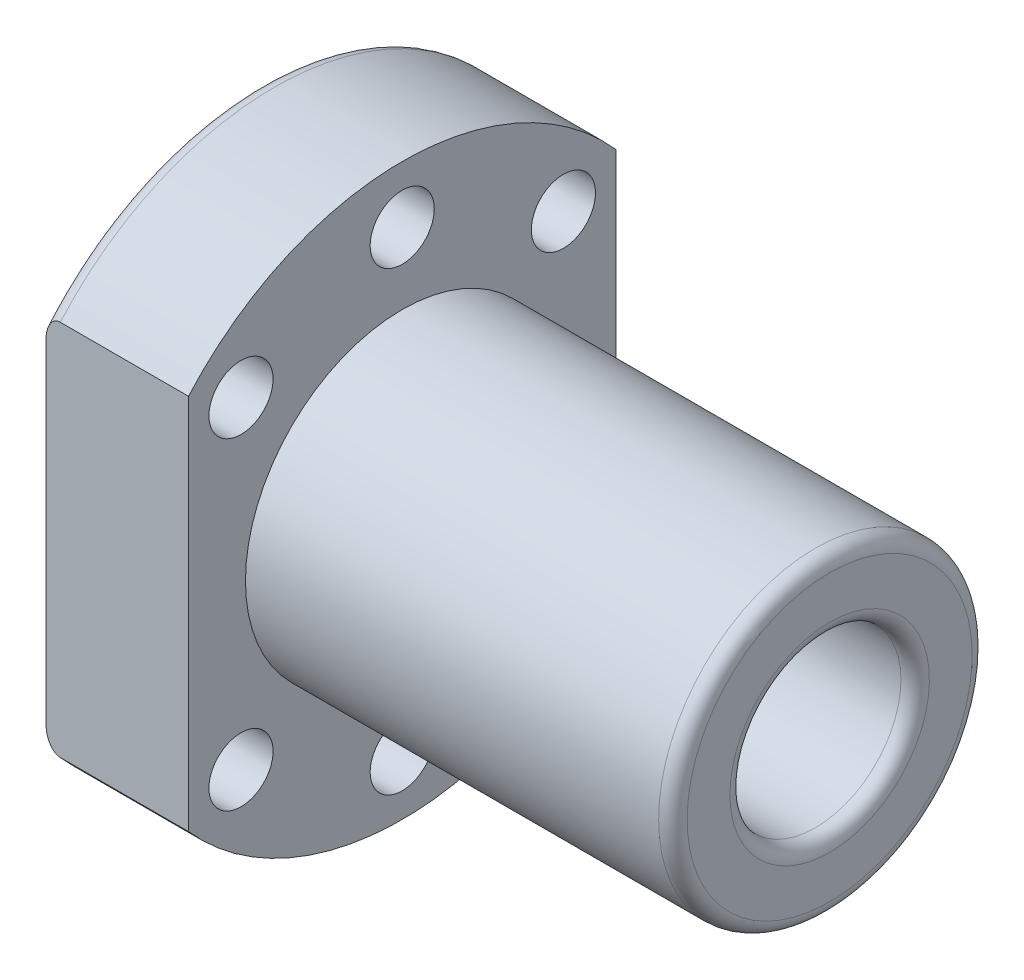
ISO-10303-21;
HEADER;
FILE_DESCRIPTION(('STEP AP214'),'2;1');
FILE_NAME('part.step','',(''),(''),'','','');
FILE_SCHEMA(('AUTOMOTIVE_DESIGN { 1 0 10303 214 1 1 1 1 }'));
ENDSEC;
DATA;
#1=APPLICATION_CONTEXT('core data for automotive mechanical design processes');
#2=APPLICATION_PROTOCOL_DEFINITION('international standard','automotive_design',2000,#1);
#3=PRODUCT_CONTEXT('',#1,'mechanical');
#4=PRODUCT('Part','Part','',(#3));
#5=PRODUCT_RELATED_PRODUCT_CATEGORY('part','',(#4));
#6=PRODUCT_DEFINITION_FORMATION('','',#4);
#7=PRODUCT_DEFINITION_CONTEXT('part definition',#1,'design');
#8=PRODUCT_DEFINITION('design','',#6,#7);
#9=PRODUCT_DEFINITION_SHAPE('','',#8);
#10=(LENGTH_UNIT() NAMED_UNIT(*) SI_UNIT(.MILLI.,.METRE.));
#11=(NAMED_UNIT(*) PLANE_ANGLE_UNIT() SI_UNIT($,.RADIAN.));
#12=(NAMED_UNIT(*) SI_UNIT($,.STERADIAN.) SOLID_ANGLE_UNIT());
#13=UNCERTAINTY_MEASURE_WITH_UNIT(LENGTH_MEASURE(1.E-05),#10,'distance_accuracy_value','');
#14=(GEOMETRIC_REPRESENTATION_CONTEXT(3) GLOBAL_UNCERTAINTY_ASSIGNED_CONTEXT((#13)) GLOBAL_UNIT_ASSIGNED_CONTEXT((#10,
#11,#12)) REPRESENTATION_CONTEXT('',''));
#15=CARTESIAN_POINT('',(0.,0.,0.));
#16=DIRECTION('',(0.,0.,1.));
#17=DIRECTION('',(1.,0.,0.));
#18=AXIS2_PLACEMENT_3D('',#15,#16,#17);
#19=CARTESIAN_POINT('',(0.,0.,0.));
#20=DIRECTION('',(-1.,0.,0.));
#21=DIRECTION('',(0.,-1.,0.));
#22=AXIS2_PLACEMENT_3D('',#19,#20,#21);
#23=PLANE('',#22);
#24=CARTESIAN_POINT('',(0.,0.,0.));
#25=DIRECTION('',(-1.,0.,0.));
#26=DIRECTION('',(0.,-1.,0.));
#27=AXIS2_PLACEMENT_3D('',#24,#25,#26);
#28=CIRCLE('',#27,7.);
#29=CARTESIAN_POINT('',(0.,-7.,0.));
#30=VERTEX_POINT('',#29);
#31=EDGE_CURVE('E158',#30,#30,#28,.F.);
#32=ORIENTED_EDGE('',*,*,#31,.T.);
#33=EDGE_LOOP('',(#32));
#34=FACE_BOUND('',#33,.T.);
#35=CARTESIAN_POINT('',(0.,16.,0.));
#36=DIRECTION('',(-1.,0.,0.));
#37=DIRECTION('',(0.,-1.,0.));
#38=AXIS2_PLACEMENT_3D('',#35,#36,#37);
#39=CIRCLE('',#38,2.25);
#40=CARTESIAN_POINT('',(0.,13.75,0.));
#41=VERTEX_POINT('',#40);
#42=EDGE_CURVE('E132',#41,#41,#39,.T.);
#43=ORIENTED_EDGE('',*,*,#42,.F.);
#44=EDGE_LOOP('',(#43));
#45=FACE_BOUND('',#44,.T.);
#46=CARTESIAN_POINT('',(0.,11.3137084989848,-11.3137084989848));
#47=DIRECTION('',(-1.,0.,0.));
#48=DIRECTION('',(0.,-1.,0.));
#49=AXIS2_PLACEMENT_3D('',#46,#47,#48);
#50=CIRCLE('',#49,2.25000000000019);
#51=CARTESIAN_POINT('',(0.,9.06370849898457,-11.3137084989848));
#52=VERTEX_POINT('',#51);
#53=EDGE_CURVE('E277',#52,#52,#50,.T.);
#54=ORIENTED_EDGE('',*,*,#53,.F.);
#55=EDGE_LOOP('',(#54));
#56=FACE_BOUND('',#55,.T.);
#57=CARTESIAN_POINT('',(0.,-11.3137084989848,-11.3137084989848));
#58=DIRECTION('',(-1.,0.,0.));
#59=DIRECTION('',(0.,-1.,0.));
#60=AXIS2_PLACEMENT_3D('',#57,#58,#59);
#61=CIRCLE('',#60,2.25000000000013);
#62=CARTESIAN_POINT('',(0.,-13.5637084989849,-11.3137084989848));
#63=VERTEX_POINT('',#62);
#64=EDGE_CURVE('E292',#63,#63,#61,.T.);
#65=ORIENTED_EDGE('',*,*,#64,.F.);
#66=EDGE_LOOP('',(#65));
#67=FACE_BOUND('',#66,.T.);
#68=CARTESIAN_POINT('',(0.,-16.,0.));
#69=DIRECTION('',(-1.,0.,0.));
#70=DIRECTION('',(0.,-1.,0.));
#71=AXIS2_PLACEMENT_3D('',#68,#69,#70);
#72=CIRCLE('',#71,2.25000000000011);
#73=CARTESIAN_POINT('',(0.,-18.2500000000001,0.));
#74=VERTEX_POINT('',#73);
#75=EDGE_CURVE('E298',#74,#74,#72,.T.);
#76=ORIENTED_EDGE('',*,*,#75,.F.);
#77=EDGE_LOOP('',(#76));
#78=FACE_BOUND('',#77,.T.);
#79=CARTESIAN_POINT('',(0.,-11.3137084989848,11.3137084989848));
#80=DIRECTION('',(-1.,0.,0.));
#81=DIRECTION('',(0.,-1.,0.));
#82=AXIS2_PLACEMENT_3D('',#79,#80,#81);
#83=CIRCLE('',#82,2.25000000000008);
#84=CARTESIAN_POINT('',(0.,-13.5637084989848,11.3137084989848));
#85=VERTEX_POINT('',#84);
#86=EDGE_CURVE('E295',#85,#85,#83,.T.);
#87=ORIENTED_EDGE('',*,*,#86,.F.);
#88=EDGE_LOOP('',(#87));
#89=FACE_BOUND('',#88,.T.);
#90=CARTESIAN_POINT('',(0.,11.3137084989848,11.3137084989848));
#91=DIRECTION('',(-1.,0.,0.));
#92=DIRECTION('',(0.,-1.,0.));
#93=AXIS2_PLACEMENT_3D('',#90,#91,#92);
#94=CIRCLE('',#93,2.25000000000003);
#95=CARTESIAN_POINT('',(0.,9.06370849898473,11.3137084989848));
#96=VERTEX_POINT('',#95);
#97=EDGE_CURVE('E289',#96,#96,#94,.T.);
#98=ORIENTED_EDGE('',*,*,#97,.F.);
#99=EDGE_LOOP('',(#98));
#100=FACE_BOUND('',#99,.T.);
#101=DIRECTION('',(0.,-1.,0.));
#102=VECTOR('',#101,1.);
#103=CARTESIAN_POINT('',(0.,25.4142915955079,-15.));
#104=LINE('',#103,#102);
#105=CARTESIAN_POINT('',(0.,11.6619037896906,-15.));
#106=VERTEX_POINT('',#105);
#107=CARTESIAN_POINT('',(0.,-11.6619037896906,-15.));
#108=VERTEX_POINT('',#107);
#109=EDGE_CURVE('E109',#106,#108,#104,.T.);
#110=ORIENTED_EDGE('',*,*,#109,.T.);
#111=CARTESIAN_POINT('',(0.,0.,0.));
#112=DIRECTION('',(-1.,0.,0.));
#113=DIRECTION('',(0.,-1.,0.));
#114=AXIS2_PLACEMENT_3D('',#111,#112,#113);
#115=CIRCLE('',#114,19.);
#116=CARTESIAN_POINT('',(0.,-11.6619037896906,15.));
#117=VERTEX_POINT('',#116);
#118=EDGE_CURVE('E156',#108,#117,#115,.T.);
#119=ORIENTED_EDGE('',*,*,#118,.T.);
#120=DIRECTION('',(0.,1.,0.));
#121=VECTOR('',#120,1.);
#122=CARTESIAN_POINT('',(0.,25.4142915955079,15.));
#123=LINE('',#122,#121);
#124=CARTESIAN_POINT('',(0.,11.6619037896906,15.));
#125=VERTEX_POINT('',#124);
#126=EDGE_CURVE('E275',#117,#125,#123,.T.);
#127=ORIENTED_EDGE('',*,*,#126,.T.);
#128=CARTESIAN_POINT('',(0.,0.,0.));
#129=DIRECTION('',(-1.,0.,0.));
#130=DIRECTION('',(0.,-1.,0.));
#131=AXIS2_PLACEMENT_3D('',#128,#129,#130);
#132=CIRCLE('',#131,19.);
#133=EDGE_CURVE('E154',#125,#106,#132,.T.);
#134=ORIENTED_EDGE('',*,*,#133,.T.);
#135=EDGE_LOOP('',(#110,#119,#127,#134));
#136=FACE_BOUND('',#135,.T.);
#137=ADVANCED_FACE('F44',(#34,#45,#56,#67,#78,#89,#100,#136),#23,.T.);
#138=CARTESIAN_POINT('',(40.,0.,0.));
#139=DIRECTION('',(1.,0.,0.));
#140=DIRECTION('',(0.,1.,0.));
#141=AXIS2_PLACEMENT_3D('',#138,#139,#140);
#142=CYLINDRICAL_SURFACE('',#141,20.);
#143=DIRECTION('',(1.,0.,0.));
#144=VECTOR('',#143,1.);
#145=CARTESIAN_POINT('',(40.,-13.2287565553229,15.));
#146=LINE('',#145,#144);
#147=CARTESIAN_POINT('',(9.99999999999999,-13.2287565553229,15.));
#148=VERTEX_POINT('',#147);
#149=CARTESIAN_POINT('',(1.,-13.2287565553229,15.));
#150=VERTEX_POINT('',#149);
#151=EDGE_CURVE('E273',#148,#150,#146,.F.);
#152=ORIENTED_EDGE('',*,*,#151,.T.);
#153=CARTESIAN_POINT('',(1.,0.,0.));
#154=DIRECTION('',(-1.,0.,0.));
#155=DIRECTION('',(0.,-1.,0.));
#156=AXIS2_PLACEMENT_3D('',#153,#154,#155);
#157=CIRCLE('',#156,20.);
#158=CARTESIAN_POINT('',(1.,-13.2287565553229,-15.));
#159=VERTEX_POINT('',#158);
#160=EDGE_CURVE('E107',#150,#159,#157,.F.);
#161=ORIENTED_EDGE('',*,*,#160,.T.);
#162=DIRECTION('',(1.,0.,0.));
#163=VECTOR('',#162,1.);
#164=CARTESIAN_POINT('',(40.,-13.2287565553229,-15.));
#165=LINE('',#164,#163);
#166=CARTESIAN_POINT('',(10.,-13.2287565553229,-15.));
#167=VERTEX_POINT('',#166);
#168=EDGE_CURVE('E100',#159,#167,#165,.T.);
#169=ORIENTED_EDGE('',*,*,#168,.T.);
#170=CARTESIAN_POINT('',(9.99999999999999,0.,0.));
#171=DIRECTION('',(1.,0.,0.));
#172=DIRECTION('',(0.,1.,0.));
#173=AXIS2_PLACEMENT_3D('',#170,#171,#172);
#174=CIRCLE('',#173,20.);
#175=EDGE_CURVE('E105',#148,#167,#174,.T.);
#176=ORIENTED_EDGE('',*,*,#175,.F.);
#177=EDGE_LOOP('',(#152,#161,#169,#176));
#178=FACE_BOUND('',#177,.T.);
#179=ADVANCED_FACE('F103',(#178),#142,.T.);
#180=DIRECTION('',(1.,0.,0.));
#181=VECTOR('',#180,1.);
#182=CARTESIAN_POINT('',(40.,13.2287565553229,-15.));
#183=LINE('',#182,#181);
#184=CARTESIAN_POINT('',(10.,13.2287565553229,-15.));
#185=VERTEX_POINT('',#184);
#186=CARTESIAN_POINT('',(1.,13.2287565553229,-15.));
#187=VERTEX_POINT('',#186);
#188=EDGE_CURVE('E108',#185,#187,#183,.F.);
#189=ORIENTED_EDGE('',*,*,#188,.T.);
#190=CARTESIAN_POINT('',(1.,0.,0.));
#191=DIRECTION('',(-1.,0.,0.));
#192=DIRECTION('',(0.,-1.,0.));
#193=AXIS2_PLACEMENT_3D('',#190,#191,#192);
#194=CIRCLE('',#193,20.);
#195=CARTESIAN_POINT('',(1.,13.2287565553229,15.));
#196=VERTEX_POINT('',#195);
#197=EDGE_CURVE('E266',#187,#196,#194,.F.);
#198=ORIENTED_EDGE('',*,*,#197,.T.);
#199=DIRECTION('',(1.,0.,0.));
#200=VECTOR('',#199,1.);
#201=CARTESIAN_POINT('',(40.,13.2287565553229,15.));
#202=LINE('',#201,#200);
#203=CARTESIAN_POINT('',(10.,13.2287565553229,15.));
#204=VERTEX_POINT('',#203);
#205=EDGE_CURVE('E278',#196,#204,#202,.T.);
#206=ORIENTED_EDGE('',*,*,#205,.T.);
#207=EDGE_CURVE('E122',#185,#204,#174,.T.);
#208=ORIENTED_EDGE('',*,*,#207,.F.);
#209=EDGE_LOOP('',(#189,#198,#206,#208));
#210=FACE_BOUND('',#209,.T.);
#211=ADVANCED_FACE('F242',(#210),#142,.T.);
#212=CARTESIAN_POINT('',(10.,20.,0.));
#213=DIRECTION('',(1.,0.,0.));
#214=DIRECTION('',(0.,1.,0.));
#215=AXIS2_PLACEMENT_3D('',#212,#213,#214);
#216=PLANE('',#215);
#217=CARTESIAN_POINT('',(10.,16.,0.));
#218=DIRECTION('',(1.,0.,0.));
#219=DIRECTION('',(0.,1.,0.));
#220=AXIS2_PLACEMENT_3D('',#217,#218,#219);
#221=CIRCLE('',#220,2.25);
#222=CARTESIAN_POINT('',(10.,18.25,0.));
#223=VERTEX_POINT('',#222);
#224=EDGE_CURVE('E144',#223,#223,#221,.T.);
#225=ORIENTED_EDGE('',*,*,#224,.F.);
#226=EDGE_LOOP('',(#225));
#227=FACE_BOUND('',#226,.T.);
#228=CARTESIAN_POINT('',(10.,11.3137084989848,-11.3137084989848));
#229=DIRECTION('',(1.,0.,0.));
#230=DIRECTION('',(0.,1.,0.));
#231=AXIS2_PLACEMENT_3D('',#228,#229,#230);
#232=CIRCLE('',#231,2.25000000000019);
#233=CARTESIAN_POINT('',(10.,13.5637084989849,-11.3137084989848));
#234=VERTEX_POINT('',#233);
#235=EDGE_CURVE('E141',#234,#234,#232,.T.);
#236=ORIENTED_EDGE('',*,*,#235,.F.);
#237=EDGE_LOOP('',(#236));
#238=FACE_BOUND('',#237,.T.);
#239=CARTESIAN_POINT('',(9.99999999999999,-11.3137084989848,-11.3137084989848));
#240=DIRECTION('',(1.,0.,0.));
#241=DIRECTION('',(0.,1.,0.));
#242=AXIS2_PLACEMENT_3D('',#239,#240,#241);
#243=CIRCLE('',#242,2.25000000000013);
#244=CARTESIAN_POINT('',(9.99999999999999,-9.06370849898463,-11.3137084989848));
#245=VERTEX_POINT('',#244);
#246=EDGE_CURVE('E138',#245,#245,#243,.T.);
#247=ORIENTED_EDGE('',*,*,#246,.F.);
#248=EDGE_LOOP('',(#247));
#249=FACE_BOUND('',#248,.T.);
#250=CARTESIAN_POINT('',(9.99999999999999,-16.,0.));
#251=DIRECTION('',(1.,0.,0.));
#252=DIRECTION('',(0.,1.,0.));
#253=AXIS2_PLACEMENT_3D('',#250,#251,#252);
#254=CIRCLE('',#253,2.25000000000011);
#255=CARTESIAN_POINT('',(9.99999999999999,-13.7499999999999,0.));
#256=VERTEX_POINT('',#255);
#257=EDGE_CURVE('E135',#256,#256,#254,.T.);
#258=ORIENTED_EDGE('',*,*,#257,.F.);
#259=EDGE_LOOP('',(#258));
#260=FACE_BOUND('',#259,.T.);
#261=CARTESIAN_POINT('',(9.99999999999999,-11.3137084989848,11.3137084989848));
#262=DIRECTION('',(1.,0.,0.));
#263=DIRECTION('',(0.,1.,0.));
#264=AXIS2_PLACEMENT_3D('',#261,#262,#263);
#265=CIRCLE('',#264,2.25000000000008);
#266=CARTESIAN_POINT('',(9.99999999999999,-9.06370849898468,11.3137084989848));
#267=VERTEX_POINT('',#266);
#268=EDGE_CURVE('E131',#267,#267,#265,.T.);
#269=ORIENTED_EDGE('',*,*,#268,.F.);
#270=EDGE_LOOP('',(#269));
#271=FACE_BOUND('',#270,.T.);
#272=CARTESIAN_POINT('',(10.,11.3137084989848,11.3137084989848));
#273=DIRECTION('',(1.,0.,0.));
#274=DIRECTION('',(0.,1.,0.));
#275=AXIS2_PLACEMENT_3D('',#272,#273,#274);
#276=CIRCLE('',#275,2.25000000000003);
#277=CARTESIAN_POINT('',(10.,13.5637084989848,11.3137084989848));
#278=VERTEX_POINT('',#277);
#279=EDGE_CURVE('E128',#278,#278,#276,.T.);
#280=ORIENTED_EDGE('',*,*,#279,.F.);
#281=EDGE_LOOP('',(#280));
#282=FACE_BOUND('',#281,.T.);
#283=CARTESIAN_POINT('',(10.,0.,0.));
#284=DIRECTION('',(1.,0.,0.));
#285=DIRECTION('',(0.,1.,0.));
#286=AXIS2_PLACEMENT_3D('',#283,#284,#285);
#287=CIRCLE('',#286,11.);
#288=CARTESIAN_POINT('',(10.,11.,0.));
#289=VERTEX_POINT('',#288);
#290=EDGE_CURVE('E124',#289,#289,#287,.T.);
#291=ORIENTED_EDGE('',*,*,#290,.F.);
#292=EDGE_LOOP('',(#291));
#293=FACE_BOUND('',#292,.T.);
#294=ORIENTED_EDGE('',*,*,#207,.T.);
#295=DIRECTION('',(0.,-1.,0.));
#296=VECTOR('',#295,1.);
#297=CARTESIAN_POINT('',(10.,20.,15.));
#298=LINE('',#297,#296);
#299=EDGE_CURVE('E117',#204,#148,#298,.T.);
#300=ORIENTED_EDGE('',*,*,#299,.T.);
#301=ORIENTED_EDGE('',*,*,#175,.T.);
#302=DIRECTION('',(0.,1.,0.));
#303=VECTOR('',#302,1.);
#304=CARTESIAN_POINT('',(10.,20.,-15.));
#305=LINE('',#304,#303);
#306=EDGE_CURVE('E112',#167,#185,#305,.T.);
#307=ORIENTED_EDGE('',*,*,#306,.T.);
#308=EDGE_LOOP('',(#294,#300,#301,#307));
#309=FACE_BOUND('',#308,.T.);
#310=ADVANCED_FACE('F120',(#227,#238,#249,#260,#271,#282,#293,#309),#216,.T.);
#311=CARTESIAN_POINT('',(40.,0.,0.));
#312=DIRECTION('',(1.,0.,0.));
#313=DIRECTION('',(0.,1.,0.));
#314=AXIS2_PLACEMENT_3D('',#311,#312,#313);
#315=CYLINDRICAL_SURFACE('',#314,11.);
#316=CARTESIAN_POINT('',(39.,0.,0.));
#317=DIRECTION('',(1.,0.,0.));
#318=DIRECTION('',(0.,1.,0.));
#319=AXIS2_PLACEMENT_3D('',#316,#317,#318);
#320=CIRCLE('',#319,11.);
#321=CARTESIAN_POINT('',(39.,11.,0.));
#322=VERTEX_POINT('',#321);
#323=EDGE_CURVE('E12',#322,#322,#320,.F.);
#324=ORIENTED_EDGE('',*,*,#323,.T.);
#325=EDGE_LOOP('',(#324));
#326=FACE_BOUND('',#325,.T.);
#327=ORIENTED_EDGE('',*,*,#290,.T.);
#328=EDGE_LOOP('',(#327));
#329=FACE_BOUND('',#328,.T.);
#330=ADVANCED_FACE('F235',(#326,#329),#315,.T.);
#331=CARTESIAN_POINT('',(40.,11.,0.));
#332=DIRECTION('',(1.,0.,0.));
#333=DIRECTION('',(0.,1.,0.));
#334=AXIS2_PLACEMENT_3D('',#331,#332,#333);
#335=PLANE('',#334);
#336=CARTESIAN_POINT('',(40.,0.,0.));
#337=DIRECTION('',(1.,0.,0.));
#338=DIRECTION('',(0.,1.,0.));
#339=AXIS2_PLACEMENT_3D('',#336,#337,#338);
#340=CIRCLE('',#339,10.);
#341=CARTESIAN_POINT('',(40.,9.99999999999999,0.));
#342=VERTEX_POINT('',#341);
#343=EDGE_CURVE('E52',#342,#342,#340,.T.);
#344=ORIENTED_EDGE('',*,*,#343,.T.);
#345=EDGE_LOOP('',(#344));
#346=FACE_BOUND('',#345,.T.);
#347=CARTESIAN_POINT('',(40.,0.,0.));
#348=DIRECTION('',(1.,0.,0.));
#349=DIRECTION('',(0.,1.,0.));
#350=AXIS2_PLACEMENT_3D('',#347,#348,#349);
#351=CIRCLE('',#350,7.);
#352=CARTESIAN_POINT('',(40.,6.99999999999999,0.));
#353=VERTEX_POINT('',#352);
#354=EDGE_CURVE('E264',#353,#353,#351,.F.);
#355=ORIENTED_EDGE('',*,*,#354,.T.);
#356=EDGE_LOOP('',(#355));
#357=FACE_BOUND('',#356,.T.);
#358=ADVANCED_FACE('F231',(#346,#357),#335,.T.);
#359=CARTESIAN_POINT('',(40.,0.,0.));
#360=DIRECTION('',(-1.,0.,0.));
#361=DIRECTION('',(0.,-1.,0.));
#362=AXIS2_PLACEMENT_3D('',#359,#360,#361);
#363=CYLINDRICAL_SURFACE('',#362,6.);
#364=CARTESIAN_POINT('',(1.,0.,0.));
#365=DIRECTION('',(-1.,0.,0.));
#366=DIRECTION('',(0.,-1.,0.));
#367=AXIS2_PLACEMENT_3D('',#364,#365,#366);
#368=CIRCLE('',#367,6.);
#369=CARTESIAN_POINT('',(1.,-6.,0.));
#370=VERTEX_POINT('',#369);
#371=EDGE_CURVE('E151',#370,#370,#368,.T.);
#372=ORIENTED_EDGE('',*,*,#371,.T.);
#373=EDGE_LOOP('',(#372));
#374=FACE_BOUND('',#373,.T.);
#375=CARTESIAN_POINT('',(39.,0.,0.));
#376=DIRECTION('',(1.,0.,0.));
#377=DIRECTION('',(0.,1.,0.));
#378=AXIS2_PLACEMENT_3D('',#375,#376,#377);
#379=CIRCLE('',#378,6.);
#380=CARTESIAN_POINT('',(39.,5.99999999999999,0.));
#381=VERTEX_POINT('',#380);
#382=EDGE_CURVE('E148',#381,#381,#379,.T.);
#383=ORIENTED_EDGE('',*,*,#382,.T.);
#384=EDGE_LOOP('',(#383));
#385=FACE_BOUND('',#384,.T.);
#386=ADVANCED_FACE('F217',(#374,#385),#363,.F.);
#387=CARTESIAN_POINT('',(40.,11.3137084989848,11.3137084989848));
#388=DIRECTION('',(-1.,0.,0.));
#389=DIRECTION('',(0.,-1.,0.));
#390=AXIS2_PLACEMENT_3D('',#387,#388,#389);
#391=CYLINDRICAL_SURFACE('',#390,2.25000000000003);
#392=ORIENTED_EDGE('',*,*,#279,.T.);
#393=EDGE_LOOP('',(#392));
#394=FACE_BOUND('',#393,.T.);
#395=ORIENTED_EDGE('',*,*,#97,.T.);
#396=EDGE_LOOP('',(#395));
#397=FACE_BOUND('',#396,.T.);
#398=ADVANCED_FACE('F213',(#394,#397),#391,.F.);
#399=CARTESIAN_POINT('',(40.,-11.3137084989848,11.3137084989848));
#400=DIRECTION('',(-1.,0.,0.));
#401=DIRECTION('',(0.,-1.,0.));
#402=AXIS2_PLACEMENT_3D('',#399,#400,#401);
#403=CYLINDRICAL_SURFACE('',#402,2.25000000000008);
#404=ORIENTED_EDGE('',*,*,#268,.T.);
#405=EDGE_LOOP('',(#404));
#406=FACE_BOUND('',#405,.T.);
#407=ORIENTED_EDGE('',*,*,#86,.T.);
#408=EDGE_LOOP('',(#407));
#409=FACE_BOUND('',#408,.T.);
#410=ADVANCED_FACE('F216',(#406,#409),#403,.F.);
#411=CARTESIAN_POINT('',(40.,-16.,0.));
#412=DIRECTION('',(-1.,0.,0.));
#413=DIRECTION('',(0.,-1.,0.));
#414=AXIS2_PLACEMENT_3D('',#411,#412,#413);
#415=CYLINDRICAL_SURFACE('',#414,2.25000000000011);
#416=ORIENTED_EDGE('',*,*,#257,.T.);
#417=EDGE_LOOP('',(#416));
#418=FACE_BOUND('',#417,.T.);
#419=ORIENTED_EDGE('',*,*,#75,.T.);
#420=EDGE_LOOP('',(#419));
#421=FACE_BOUND('',#420,.T.);
#422=ADVANCED_FACE('F221',(#418,#421),#415,.F.);
#423=CARTESIAN_POINT('',(40.,-11.3137084989848,-11.3137084989848));
#424=DIRECTION('',(-1.,0.,0.));
#425=DIRECTION('',(0.,-1.,0.));
#426=AXIS2_PLACEMENT_3D('',#423,#424,#425);
#427=CYLINDRICAL_SURFACE('',#426,2.25000000000013);
#428=ORIENTED_EDGE('',*,*,#246,.T.);
#429=EDGE_LOOP('',(#428));
#430=FACE_BOUND('',#429,.T.);
#431=ORIENTED_EDGE('',*,*,#64,.T.);
#432=EDGE_LOOP('',(#431));
#433=FACE_BOUND('',#432,.T.);
#434=ADVANCED_FACE('F211',(#430,#433),#427,.F.);
#435=CARTESIAN_POINT('',(40.,11.3137084989848,-11.3137084989848));
#436=DIRECTION('',(-1.,0.,0.));
#437=DIRECTION('',(0.,-1.,0.));
#438=AXIS2_PLACEMENT_3D('',#435,#436,#437);
#439=CYLINDRICAL_SURFACE('',#438,2.25000000000019);
#440=ORIENTED_EDGE('',*,*,#235,.T.);
#441=EDGE_LOOP('',(#440));
#442=FACE_BOUND('',#441,.T.);
#443=ORIENTED_EDGE('',*,*,#53,.T.);
#444=EDGE_LOOP('',(#443));
#445=FACE_BOUND('',#444,.T.);
#446=ADVANCED_FACE('F207',(#442,#445),#439,.F.);
#447=CARTESIAN_POINT('',(40.,16.,0.));
#448=DIRECTION('',(-1.,0.,0.));
#449=DIRECTION('',(0.,-1.,0.));
#450=AXIS2_PLACEMENT_3D('',#447,#448,#449);
#451=CYLINDRICAL_SURFACE('',#450,2.25);
#452=ORIENTED_EDGE('',*,*,#224,.T.);
#453=EDGE_LOOP('',(#452));
#454=FACE_BOUND('',#453,.T.);
#455=ORIENTED_EDGE('',*,*,#42,.T.);
#456=EDGE_LOOP('',(#455));
#457=FACE_BOUND('',#456,.T.);
#458=ADVANCED_FACE('F203',(#454,#457),#451,.F.);
#459=CARTESIAN_POINT('',(10.,25.4142915955079,-15.));
#460=DIRECTION('',(0.,0.,-1.));
#461=DIRECTION('',(0.,1.,0.));
#462=AXIS2_PLACEMENT_3D('',#459,#460,#461);
#463=PLANE('',#462);
#464=ORIENTED_EDGE('',*,*,#168,.F.);
#465=CARTESIAN_POINT('',(0.999999999999998,-13.2287565553229,-15.));
#466=CARTESIAN_POINT('',(0.978497506056032,-13.2287613149851,-15.));
#467=CARTESIAN_POINT('',(0.957009028721555,-13.227707074018,-15.));
#468=CARTESIAN_POINT('',(0.914252417279844,-13.2235348793558,-15.));
#469=CARTESIAN_POINT('',(0.892984101450285,-13.2204187931744,-15.));
#470=CARTESIAN_POINT('',(0.830176660565185,-13.2081417045182,-15.));
#471=CARTESIAN_POINT('',(0.789181812448807,-13.1960493270328,-15.));
#472=CARTESIAN_POINT('',(0.710081618960237,-13.1650615066288,-15.));
#473=CARTESIAN_POINT('',(0.671967307054911,-13.1461883241127,-15.));
#474=CARTESIAN_POINT('',(0.599004007492674,-13.1028226882431,-15.));
#475=CARTESIAN_POINT('',(0.564163605422969,-13.0783160106376,-15.));
#476=CARTESIAN_POINT('',(0.483111864886722,-13.0127700501821,-15.));
#477=CARTESIAN_POINT('',(0.438895763335639,-12.9692695637147,-15.));
#478=CARTESIAN_POINT('',(0.357920530650456,-12.8758557362334,-15.));
#479=CARTESIAN_POINT('',(0.321174978517459,-12.8259309821848,-15.));
#480=CARTESIAN_POINT('',(0.238126649311484,-12.6960083689776,-15.));
#481=CARTESIAN_POINT('',(0.196049666093627,-12.613323325051,-15.));
#482=CARTESIAN_POINT('',(0.125070205235148,-12.4423369167924,-15.));
#483=CARTESIAN_POINT('',(0.0962166598731283,-12.3540160486264,-15.));
#484=CARTESIAN_POINT('',(0.0605347119561053,-12.2148746225632,-15.));
#485=CARTESIAN_POINT('',(0.0496361877590558,-12.1650462884977,-15.));
#486=CARTESIAN_POINT('',(0.0311596705512269,-12.0647594859958,-15.));
#487=CARTESIAN_POINT('',(0.0235825420703984,-12.0143008570101,-15.));
#488=CARTESIAN_POINT('',(0.0116472592908051,-11.9135818667028,-15.));
#489=CARTESIAN_POINT('',(0.00725416134764524,-11.8633255660436,-15.));
#490=CARTESIAN_POINT('',(0.00143500593718696,-11.7626785725983,-15.));
#491=CARTESIAN_POINT('',(6.69538609242736E-06,-11.7122880110262,-15.));
#492=CARTESIAN_POINT('',(0.,-11.6619037896906,-15.));
#493=B_SPLINE_CURVE_WITH_KNOTS('',3,(#465,#466,#467,#468,#469,#470,#471,#472,#473,#474,#475,
#476,#477,#478,#479,#480,#481,#482,#483,#484,#485,#486,#487,#488,#489,#490,#491,#492),
.UNSPECIFIED.,.F.,.F.,(4,2,2,2,2,2,2,2,2,2,2,2,2,4),(0.,0.0644553097502216,0.128852318950458,
0.256308981530836,0.383350989266993,0.51071736435133,0.695759932793819,0.881135898423255,
1.1579476234799,1.43577555782349,1.5886975615402,1.74165934590119,1.89291590276852,
2.04405747039477),.UNSPECIFIED.);
#494=EDGE_CURVE('E169',#159,#108,#493,.T.);
#495=ORIENTED_EDGE('',*,*,#494,.T.);
#496=ORIENTED_EDGE('',*,*,#109,.F.);
#497=CARTESIAN_POINT('',(0.,11.6619037896906,-15.));
#498=CARTESIAN_POINT('',(2.41875724536144E-05,11.7310208900074,-15.));
#499=CARTESIAN_POINT('',(0.00270201833390893,11.8001699811892,-15.));
#500=CARTESIAN_POINT('',(0.0137339514701039,11.9382429126277,-15.));
#501=CARTESIAN_POINT('',(0.0221071332926568,12.0071652108115,-15.));
#502=CARTESIAN_POINT('',(0.0450552350343658,12.1449345271204,-15.));
#503=CARTESIAN_POINT('',(0.0597112900180999,12.2137683098384,-15.));
#504=CARTESIAN_POINT('',(0.0957716914595835,12.3495572552376,-15.));
#505=CARTESIAN_POINT('',(0.117165309684682,12.4165152214745,-15.));
#506=CARTESIAN_POINT('',(0.167664417399176,12.5482237173805,-15.));
#507=CARTESIAN_POINT('',(0.196840345690787,12.6129476577345,-15.));
#508=CARTESIAN_POINT('',(0.263640126484504,12.7377249664441,-15.));
#509=CARTESIAN_POINT('',(0.301235645669622,12.7977931103217,-15.));
#510=CARTESIAN_POINT('',(0.377301551038133,12.8995180119297,-15.));
#511=CARTESIAN_POINT('',(0.414061774976185,12.9424430708719,-15.));
#512=CARTESIAN_POINT('',(0.493946945913842,13.021981322163,-15.));
#513=CARTESIAN_POINT('',(0.537064676885845,13.0586015698931,-15.));
#514=CARTESIAN_POINT('',(0.618126098735986,13.1151193662855,-15.));
#515=CARTESIAN_POINT('',(0.65474117977447,13.1369152166252,-15.));
#516=CARTESIAN_POINT('',(0.731001075752636,13.1742271754043,-15.));
#517=CARTESIAN_POINT('',(0.770638260721654,13.1897585140292,-15.));
#518=CARTESIAN_POINT('',(0.841888992694432,13.2104730325176,-15.));
#519=CARTESIAN_POINT('',(0.873036071958615,13.2172714560351,-15.));
#520=CARTESIAN_POINT('',(0.93610699795808,13.2264403176147,-15.));
#521=CARTESIAN_POINT('',(0.968033601026093,13.2287916588442,-15.));
#522=CARTESIAN_POINT('',(1.,13.2287565553229,-15.));
#523=B_SPLINE_CURVE_WITH_KNOTS('',3,(#497,#498,#499,#500,#501,#502,#503,#504,#505,#506,#507,
#508,#509,#510,#511,#512,#513,#514,#515,#516,#517,#518,#519,#520,#521,#522),.UNSPECIFIED.,.F.,
.F.,(4,2,2,2,2,2,2,2,2,2,2,2,4),(0.,0.207349193546602,0.415396451172017,0.626215368155832,
0.836700280768109,1.04915907412049,1.26091337412721,1.42990132709323,1.59869892775633,
1.72605544852638,1.853100448238,1.94843755628184,2.0441831431908),.UNSPECIFIED.);
#524=EDGE_CURVE('E67',#106,#187,#523,.T.);
#525=ORIENTED_EDGE('',*,*,#524,.T.);
#526=ORIENTED_EDGE('',*,*,#188,.F.);
#527=ORIENTED_EDGE('',*,*,#306,.F.);
#528=EDGE_LOOP('',(#464,#495,#496,#525,#526,#527));
#529=FACE_BOUND('',#528,.T.);
#530=ADVANCED_FACE('F113',(#529),#463,.T.);
#531=CARTESIAN_POINT('',(10.,25.4142915955079,15.));
#532=DIRECTION('',(0.,0.,1.));
#533=DIRECTION('',(0.,-1.,0.));
#534=AXIS2_PLACEMENT_3D('',#531,#532,#533);
#535=PLANE('',#534);
#536=ORIENTED_EDGE('',*,*,#126,.F.);
#537=CARTESIAN_POINT('',(0.,-11.6619037896906,15.));
#538=CARTESIAN_POINT('',(2.41875724490575E-05,-11.7310208900074,15.));
#539=CARTESIAN_POINT('',(0.00270201833390425,-11.8001699811892,15.));
#540=CARTESIAN_POINT('',(0.013733951470099,-11.9382429126277,15.));
#541=CARTESIAN_POINT('',(0.0221071332926518,-12.0071652108115,15.));
#542=CARTESIAN_POINT('',(0.0450552350343609,-12.1449345271204,15.));
#543=CARTESIAN_POINT('',(0.0597112900180952,-12.2137683098384,15.));
#544=CARTESIAN_POINT('',(0.0957716914595789,-12.3495572552376,15.));
#545=CARTESIAN_POINT('',(0.117165309684678,-12.4165152214745,15.));
#546=CARTESIAN_POINT('',(0.167664417399171,-12.5482237173805,15.));
#547=CARTESIAN_POINT('',(0.196840345690781,-12.6129476577345,15.));
#548=CARTESIAN_POINT('',(0.263640126484498,-12.7377249664441,15.));
#549=CARTESIAN_POINT('',(0.301235645669617,-12.7977931103217,15.));
#550=CARTESIAN_POINT('',(0.377301551038128,-12.8995180119297,15.));
#551=CARTESIAN_POINT('',(0.41406177497618,-12.9424430708719,15.));
#552=CARTESIAN_POINT('',(0.493946945913837,-13.021981322163,15.));
#553=CARTESIAN_POINT('',(0.53706467688584,-13.0586015698931,15.));
#554=CARTESIAN_POINT('',(0.618126098735981,-13.1151193662855,15.));
#555=CARTESIAN_POINT('',(0.654741179774465,-13.1369152166252,15.));
#556=CARTESIAN_POINT('',(0.731001075752632,-13.1742271754043,15.));
#557=CARTESIAN_POINT('',(0.770638260721649,-13.1897585140292,15.));
#558=CARTESIAN_POINT('',(0.841888992694428,-13.2104730325176,15.));
#559=CARTESIAN_POINT('',(0.873036071958611,-13.2172714560351,15.));
#560=CARTESIAN_POINT('',(0.936106997958075,-13.2264403176147,15.));
#561=CARTESIAN_POINT('',(0.968033601026088,-13.2287916588442,15.));
#562=CARTESIAN_POINT('',(0.999999999999999,-13.2287565553229,15.));
#563=B_SPLINE_CURVE_WITH_KNOTS('',3,(#537,#538,#539,#540,#541,#542,#543,#544,#545,#546,#547,
#548,#549,#550,#551,#552,#553,#554,#555,#556,#557,#558,#559,#560,#561,#562),.UNSPECIFIED.,.F.,
.F.,(4,2,2,2,2,2,2,2,2,2,2,2,4),(0.,0.207349193546602,0.415396451172017,0.626215368155832,
0.836700280768109,1.04915907412049,1.26091337412721,1.42990132709323,1.59869892775633,
1.72605544852638,1.853100448238,1.94843755628184,2.0441831431908),.UNSPECIFIED.);
#564=EDGE_CURVE('E191',#117,#150,#563,.T.);
#565=ORIENTED_EDGE('',*,*,#564,.T.);
#566=ORIENTED_EDGE('',*,*,#151,.F.);
#567=ORIENTED_EDGE('',*,*,#299,.F.);
#568=ORIENTED_EDGE('',*,*,#205,.F.);
#569=CARTESIAN_POINT('',(1.,13.2287565553229,15.));
#570=CARTESIAN_POINT('',(0.978497506056037,13.2287613149851,15.));
#571=CARTESIAN_POINT('',(0.957009028721561,13.227707074018,15.));
#572=CARTESIAN_POINT('',(0.91425241727985,13.2235348793558,15.));
#573=CARTESIAN_POINT('',(0.892984101450291,13.2204187931744,15.));
#574=CARTESIAN_POINT('',(0.83017666056519,13.2081417045182,15.));
#575=CARTESIAN_POINT('',(0.789181812448812,13.1960493270328,15.));
#576=CARTESIAN_POINT('',(0.710081618960243,13.1650615066288,15.));
#577=CARTESIAN_POINT('',(0.671967307054918,13.1461883241127,15.));
#578=CARTESIAN_POINT('',(0.599004007492681,13.1028226882431,15.));
#579=CARTESIAN_POINT('',(0.564163605422975,13.0783160106376,15.));
#580=CARTESIAN_POINT('',(0.483111864886728,13.0127700501821,15.));
#581=CARTESIAN_POINT('',(0.438895763335646,12.9692695637147,15.));
#582=CARTESIAN_POINT('',(0.357920530650463,12.8758557362334,15.));
#583=CARTESIAN_POINT('',(0.321174978517465,12.8259309821848,15.));
#584=CARTESIAN_POINT('',(0.238126649311489,12.6960083689776,15.));
#585=CARTESIAN_POINT('',(0.196049666093634,12.613323325051,15.));
#586=CARTESIAN_POINT('',(0.125070205235154,12.4423369167924,15.));
#587=CARTESIAN_POINT('',(0.0962166598731328,12.3540160486264,15.));
#588=CARTESIAN_POINT('',(0.0605347119561102,12.2148746225632,15.));
#589=CARTESIAN_POINT('',(0.0496361877590614,12.1650462884977,15.));
#590=CARTESIAN_POINT('',(0.031159670551233,12.0647594859958,15.));
#591=CARTESIAN_POINT('',(0.0235825420704041,12.0143008570101,15.));
#592=CARTESIAN_POINT('',(0.0116472592908101,11.9135818667028,15.));
#593=CARTESIAN_POINT('',(0.00725416134765011,11.8633255660436,15.));
#594=CARTESIAN_POINT('',(0.00143500593719158,11.7626785725983,15.));
#595=CARTESIAN_POINT('',(6.6953860969556E-06,11.7122880110262,15.));
#596=CARTESIAN_POINT('',(0.,11.6619037896906,15.));
#597=B_SPLINE_CURVE_WITH_KNOTS('',3,(#569,#570,#571,#572,#573,#574,#575,#576,#577,#578,#579,
#580,#581,#582,#583,#584,#585,#586,#587,#588,#589,#590,#591,#592,#593,#594,#595,#596),
.UNSPECIFIED.,.F.,.F.,(4,2,2,2,2,2,2,2,2,2,2,2,2,4),(0.,0.064455309750221,0.128852318950457,
0.256308981530836,0.383350989266992,0.51071736435133,0.695759932793819,0.881135898423255,
1.15794762347989,1.43577555782348,1.5886975615402,1.74165934590119,1.89291590276852,
2.04405747039477),.UNSPECIFIED.);
#598=EDGE_CURVE('E59',#196,#125,#597,.T.);
#599=ORIENTED_EDGE('',*,*,#598,.T.);
#600=EDGE_LOOP('',(#536,#565,#566,#567,#568,#599));
#601=FACE_BOUND('',#600,.T.);
#602=ADVANCED_FACE('F197',(#601),#535,.T.);
#603=CARTESIAN_POINT('',(1.,0.,0.));
#604=DIRECTION('',(-1.,0.,0.));
#605=DIRECTION('',(0.,-1.,0.));
#606=AXIS2_PLACEMENT_3D('',#603,#604,#605);
#607=TOROIDAL_SURFACE('',#606,7.,1.);
#608=ORIENTED_EDGE('',*,*,#31,.F.);
#609=EDGE_LOOP('',(#608));
#610=FACE_BOUND('',#609,.T.);
#611=ORIENTED_EDGE('',*,*,#371,.F.);
#612=EDGE_LOOP('',(#611));
#613=FACE_BOUND('',#612,.T.);
#614=ADVANCED_FACE('F201',(#610,#613),#607,.T.);
#615=CARTESIAN_POINT('',(1.,0.,0.));
#616=DIRECTION('',(-1.,0.,0.));
#617=DIRECTION('',(0.,-1.,0.));
#618=AXIS2_PLACEMENT_3D('',#615,#616,#617);
#619=TOROIDAL_SURFACE('',#618,19.,1.);
#620=ORIENTED_EDGE('',*,*,#564,.F.);
#621=ORIENTED_EDGE('',*,*,#118,.F.);
#622=ORIENTED_EDGE('',*,*,#494,.F.);
#623=ORIENTED_EDGE('',*,*,#160,.F.);
#624=EDGE_LOOP('',(#620,#621,#622,#623));
#625=FACE_BOUND('',#624,.T.);
#626=ADVANCED_FACE('F182',(#625),#619,.T.);
#627=CARTESIAN_POINT('',(1.,0.,0.));
#628=DIRECTION('',(-1.,0.,0.));
#629=DIRECTION('',(0.,-1.,0.));
#630=AXIS2_PLACEMENT_3D('',#627,#628,#629);
#631=TOROIDAL_SURFACE('',#630,19.,1.);
#632=ORIENTED_EDGE('',*,*,#524,.F.);
#633=ORIENTED_EDGE('',*,*,#133,.F.);
#634=ORIENTED_EDGE('',*,*,#598,.F.);
#635=ORIENTED_EDGE('',*,*,#197,.F.);
#636=EDGE_LOOP('',(#632,#633,#634,#635));
#637=FACE_BOUND('',#636,.T.);
#638=ADVANCED_FACE('F178',(#637),#631,.T.);
#639=CARTESIAN_POINT('',(39.,0.,0.));
#640=DIRECTION('',(1.,0.,0.));
#641=DIRECTION('',(0.,1.,0.));
#642=AXIS2_PLACEMENT_3D('',#639,#640,#641);
#643=TOROIDAL_SURFACE('',#642,10.,1.);
#644=ORIENTED_EDGE('',*,*,#323,.F.);
#645=EDGE_LOOP('',(#644));
#646=FACE_BOUND('',#645,.T.);
#647=ORIENTED_EDGE('',*,*,#343,.F.);
#648=EDGE_LOOP('',(#647));
#649=FACE_BOUND('',#648,.T.);
#650=ADVANCED_FACE('F181',(#646,#649),#643,.T.);
#651=CARTESIAN_POINT('',(39.,0.,0.));
#652=DIRECTION('',(1.,0.,0.));
#653=DIRECTION('',(0.,1.,0.));
#654=AXIS2_PLACEMENT_3D('',#651,#652,#653);
#655=TOROIDAL_SURFACE('',#654,7.,1.);
#656=ORIENTED_EDGE('',*,*,#382,.F.);
#657=EDGE_LOOP('',(#656));
#658=FACE_BOUND('',#657,.T.);
#659=ORIENTED_EDGE('',*,*,#354,.F.);
#660=EDGE_LOOP('',(#659));
#661=FACE_BOUND('',#660,.T.);
#662=ADVANCED_FACE('F46',(#658,#661),#655,.T.);
#663=CLOSED_SHELL('',(#137,#179,#211,#310,#330,#358,#386,#398,#410,#422,#434,#446,#458,#530,
#602,#614,#626,#638,#650,#662));
#664=MANIFOLD_SOLID_BREP('B2',#663);
#665=ADVANCED_BREP_SHAPE_REPRESENTATION('',(#18,#664),#14);
#666=SHAPE_DEFINITION_REPRESENTATION(#9,#665);
ENDSEC;
END-ISO-10303-21;
